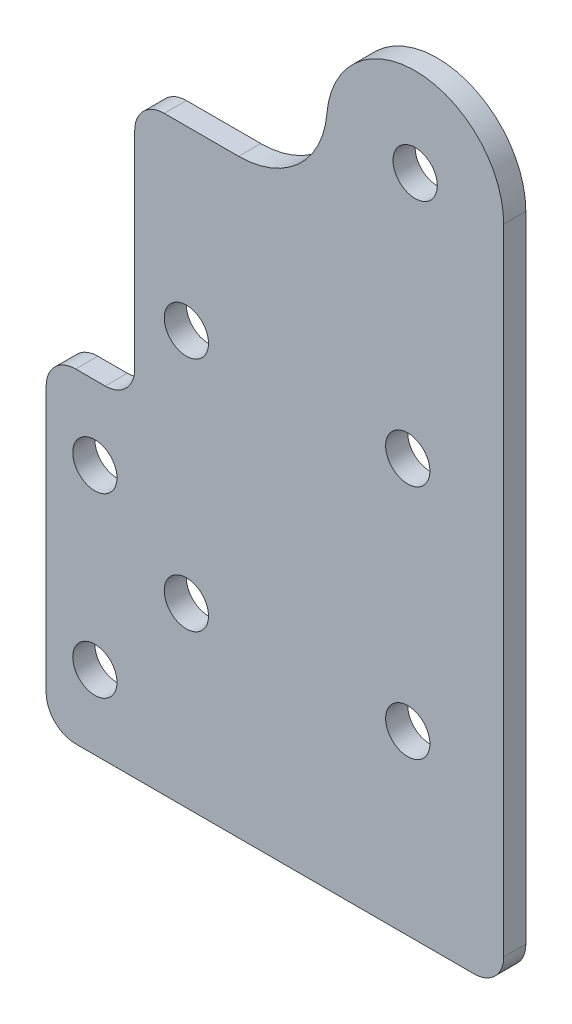
ISO-10303-21;
HEADER;
FILE_DESCRIPTION(('STEP AP214'),'2;1');
FILE_NAME('part.step','',(''),(''),'','','');
FILE_SCHEMA(('AUTOMOTIVE_DESIGN { 1 0 10303 214 1 1 1 1 }'));
ENDSEC;
DATA;
#1=APPLICATION_CONTEXT('core data for automotive mechanical design processes');
#2=APPLICATION_PROTOCOL_DEFINITION('international standard','automotive_design',2000,#1);
#3=PRODUCT_CONTEXT('',#1,'mechanical');
#4=PRODUCT('Part','Part','',(#3));
#5=PRODUCT_RELATED_PRODUCT_CATEGORY('part','',(#4));
#6=PRODUCT_DEFINITION_FORMATION('','',#4);
#7=PRODUCT_DEFINITION_CONTEXT('part definition',#1,'design');
#8=PRODUCT_DEFINITION('design','',#6,#7);
#9=PRODUCT_DEFINITION_SHAPE('','',#8);
#10=(LENGTH_UNIT() NAMED_UNIT(*) SI_UNIT(.MILLI.,.METRE.));
#11=(NAMED_UNIT(*) PLANE_ANGLE_UNIT() SI_UNIT($,.RADIAN.));
#12=(NAMED_UNIT(*) SI_UNIT($,.STERADIAN.) SOLID_ANGLE_UNIT());
#13=UNCERTAINTY_MEASURE_WITH_UNIT(LENGTH_MEASURE(1.E-05),#10,'distance_accuracy_value','');
#14=(GEOMETRIC_REPRESENTATION_CONTEXT(3) GLOBAL_UNCERTAINTY_ASSIGNED_CONTEXT((#13)) GLOBAL_UNIT_ASSIGNED_CONTEXT((#10,
#11,#12)) REPRESENTATION_CONTEXT('',''));
#15=CARTESIAN_POINT('',(0.,0.,0.));
#16=DIRECTION('',(0.,0.,1.));
#17=DIRECTION('',(1.,0.,0.));
#18=AXIS2_PLACEMENT_3D('',#15,#16,#17);
#19=CARTESIAN_POINT('',(0.,0.,1.5));
#20=DIRECTION('',(0.,0.,-1.));
#21=DIRECTION('',(-1.,0.,0.));
#22=AXIS2_PLACEMENT_3D('',#19,#20,#21);
#23=PLANE('',#22);
#24=CARTESIAN_POINT('',(-13.7,-15.,1.5));
#25=DIRECTION('',(0.,0.,1.));
#26=DIRECTION('',(-1.,0.,0.));
#27=AXIS2_PLACEMENT_3D('',#24,#25,#26);
#28=CIRCLE('',#27,1.5);
#29=CARTESIAN_POINT('',(-15.2,-15.,1.5));
#30=VERTEX_POINT('',#29);
#31=EDGE_CURVE('E266',#30,#30,#28,.T.);
#32=ORIENTED_EDGE('',*,*,#31,.F.);
#33=EDGE_LOOP('',(#32));
#34=FACE_BOUND('',#33,.T.);
#35=CARTESIAN_POINT('',(-13.7,-3.,1.5));
#36=DIRECTION('',(0.,0.,1.));
#37=DIRECTION('',(1.,0.,0.));
#38=AXIS2_PLACEMENT_3D('',#35,#36,#37);
#39=CIRCLE('',#38,1.5);
#40=CARTESIAN_POINT('',(-12.2,-3.,1.5));
#41=VERTEX_POINT('',#40);
#42=EDGE_CURVE('E276',#41,#41,#39,.T.);
#43=ORIENTED_EDGE('',*,*,#42,.F.);
#44=EDGE_LOOP('',(#43));
#45=FACE_BOUND('',#44,.T.);
#46=DIRECTION('',(-1.,0.,0.));
#47=VECTOR('',#46,1.);
#48=CARTESIAN_POINT('',(-14.,20.,1.5));
#49=LINE('',#48,#47);
#50=CARTESIAN_POINT('',(-3.9582607431014,20.,1.5));
#51=VERTEX_POINT('',#50);
#52=CARTESIAN_POINT('',(-9.,20.,1.5));
#53=VERTEX_POINT('',#52);
#54=EDGE_CURVE('E189',#51,#53,#49,.T.);
#55=ORIENTED_EDGE('',*,*,#54,.T.);
#56=CARTESIAN_POINT('',(-9.,18.,1.5));
#57=DIRECTION('',(0.,0.,-1.));
#58=DIRECTION('',(-1.,0.,0.));
#59=AXIS2_PLACEMENT_3D('',#56,#57,#58);
#60=CIRCLE('',#59,2.);
#61=CARTESIAN_POINT('',(-11.,18.,1.5));
#62=VERTEX_POINT('',#61);
#63=EDGE_CURVE('E216',#53,#62,#60,.F.);
#64=ORIENTED_EDGE('',*,*,#63,.T.);
#65=DIRECTION('',(0.,1.,0.));
#66=VECTOR('',#65,1.);
#67=CARTESIAN_POINT('',(-11.,2.,1.5));
#68=LINE('',#67,#66);
#69=CARTESIAN_POINT('',(-11.,4.00000000000001,1.5));
#70=VERTEX_POINT('',#69);
#71=EDGE_CURVE('E249',#70,#62,#68,.T.);
#72=ORIENTED_EDGE('',*,*,#71,.F.);
#73=CARTESIAN_POINT('',(-13.,4.00000000000001,1.5));
#74=DIRECTION('',(0.,0.,-1.));
#75=DIRECTION('',(-1.,0.,0.));
#76=AXIS2_PLACEMENT_3D('',#73,#74,#75);
#77=CIRCLE('',#76,2.);
#78=CARTESIAN_POINT('',(-13.,2.00000000000001,1.5));
#79=VERTEX_POINT('',#78);
#80=EDGE_CURVE('E40',#70,#79,#77,.T.);
#81=ORIENTED_EDGE('',*,*,#80,.T.);
#82=DIRECTION('',(-1.,0.,0.));
#83=VECTOR('',#82,1.);
#84=CARTESIAN_POINT('',(-14.,2.00000000000001,1.5));
#85=LINE('',#84,#83);
#86=CARTESIAN_POINT('',(-15.,2.,1.5));
#87=VERTEX_POINT('',#86);
#88=EDGE_CURVE('E247',#79,#87,#85,.T.);
#89=ORIENTED_EDGE('',*,*,#88,.T.);
#90=CARTESIAN_POINT('',(-15.,0.,1.5));
#91=DIRECTION('',(0.,0.,-1.));
#92=DIRECTION('',(-1.,0.,0.));
#93=AXIS2_PLACEMENT_3D('',#90,#91,#92);
#94=CIRCLE('',#93,2.);
#95=CARTESIAN_POINT('',(-17.,0.,1.5));
#96=VERTEX_POINT('',#95);
#97=EDGE_CURVE('E210',#87,#96,#94,.F.);
#98=ORIENTED_EDGE('',*,*,#97,.T.);
#99=DIRECTION('',(0.,-1.,0.));
#100=VECTOR('',#99,1.);
#101=CARTESIAN_POINT('',(-17.,2.,1.5));
#102=LINE('',#101,#100);
#103=CARTESIAN_POINT('',(-17.,-18.,1.5));
#104=VERTEX_POINT('',#103);
#105=EDGE_CURVE('E254',#96,#104,#102,.T.);
#106=ORIENTED_EDGE('',*,*,#105,.T.);
#107=CARTESIAN_POINT('',(-15.,-18.,1.5));
#108=DIRECTION('',(0.,0.,-1.));
#109=DIRECTION('',(-1.,0.,0.));
#110=AXIS2_PLACEMENT_3D('',#107,#108,#109);
#111=CIRCLE('',#110,2.);
#112=CARTESIAN_POINT('',(-15.,-20.,1.5));
#113=VERTEX_POINT('',#112);
#114=EDGE_CURVE('E214',#104,#113,#111,.F.);
#115=ORIENTED_EDGE('',*,*,#114,.T.);
#116=DIRECTION('',(1.,0.,0.));
#117=VECTOR('',#116,1.);
#118=CARTESIAN_POINT('',(-14.,-20.,1.5));
#119=LINE('',#118,#117);
#120=CARTESIAN_POINT('',(12.,-20.,1.5));
#121=VERTEX_POINT('',#120);
#122=EDGE_CURVE('E193',#113,#121,#119,.T.);
#123=ORIENTED_EDGE('',*,*,#122,.T.);
#124=CARTESIAN_POINT('',(12.,-18.,1.5));
#125=DIRECTION('',(0.,0.,-1.));
#126=DIRECTION('',(-1.,0.,0.));
#127=AXIS2_PLACEMENT_3D('',#124,#125,#126);
#128=CIRCLE('',#127,2.);
#129=CARTESIAN_POINT('',(14.,-18.,1.5));
#130=VERTEX_POINT('',#129);
#131=EDGE_CURVE('E212',#121,#130,#128,.F.);
#132=ORIENTED_EDGE('',*,*,#131,.T.);
#133=DIRECTION('',(0.,1.,0.));
#134=VECTOR('',#133,1.);
#135=CARTESIAN_POINT('',(14.,-20.,1.5));
#136=LINE('',#135,#134);
#137=CARTESIAN_POINT('',(14.,25.,1.5));
#138=VERTEX_POINT('',#137);
#139=EDGE_CURVE('E187',#130,#138,#136,.T.);
#140=ORIENTED_EDGE('',*,*,#139,.T.);
#141=CARTESIAN_POINT('',(8.,25.,1.5));
#142=DIRECTION('',(0.,0.,1.));
#143=DIRECTION('',(1.,0.,0.));
#144=AXIS2_PLACEMENT_3D('',#141,#142,#143);
#145=CIRCLE('',#144,6.);
#146=CARTESIAN_POINT('',(2.0208696284493,25.5,1.5));
#147=VERTEX_POINT('',#146);
#148=EDGE_CURVE('E156',#138,#147,#145,.T.);
#149=ORIENTED_EDGE('',*,*,#148,.T.);
#150=CARTESIAN_POINT('',(-3.9582607431014,26.,1.5));
#151=DIRECTION('',(0.,0.,-1.));
#152=DIRECTION('',(-1.,0.,0.));
#153=AXIS2_PLACEMENT_3D('',#150,#151,#152);
#154=CIRCLE('',#153,6.);
#155=EDGE_CURVE('E204',#147,#51,#154,.T.);
#156=ORIENTED_EDGE('',*,*,#155,.T.);
#157=EDGE_LOOP('',(#55,#64,#72,#81,#89,#98,#106,#115,#123,#132,#140,#149,#156));
#158=FACE_BOUND('',#157,.T.);
#159=CARTESIAN_POINT('',(-7.5,8.,1.5));
#160=DIRECTION('',(0.,0.,1.));
#161=DIRECTION('',(1.,0.,0.));
#162=AXIS2_PLACEMENT_3D('',#159,#160,#161);
#163=CIRCLE('',#162,1.5);
#164=CARTESIAN_POINT('',(-6.,8.,1.5));
#165=VERTEX_POINT('',#164);
#166=EDGE_CURVE('E139',#165,#165,#163,.T.);
#167=ORIENTED_EDGE('',*,*,#166,.F.);
#168=EDGE_LOOP('',(#167));
#169=FACE_BOUND('',#168,.T.);
#170=CARTESIAN_POINT('',(7.5,8.,1.5));
#171=DIRECTION('',(0.,0.,1.));
#172=DIRECTION('',(-1.,0.,0.));
#173=AXIS2_PLACEMENT_3D('',#170,#171,#172);
#174=CIRCLE('',#173,1.5);
#175=CARTESIAN_POINT('',(6.,8.,1.5));
#176=VERTEX_POINT('',#175);
#177=EDGE_CURVE('E177',#176,#176,#174,.T.);
#178=ORIENTED_EDGE('',*,*,#177,.F.);
#179=EDGE_LOOP('',(#178));
#180=FACE_BOUND('',#179,.T.);
#181=CARTESIAN_POINT('',(7.5,-8.,1.5));
#182=DIRECTION('',(0.,0.,1.));
#183=DIRECTION('',(1.,0.,0.));
#184=AXIS2_PLACEMENT_3D('',#181,#182,#183);
#185=CIRCLE('',#184,1.5);
#186=CARTESIAN_POINT('',(9.00000000000001,-8.,1.5));
#187=VERTEX_POINT('',#186);
#188=EDGE_CURVE('E171',#187,#187,#185,.T.);
#189=ORIENTED_EDGE('',*,*,#188,.F.);
#190=EDGE_LOOP('',(#189));
#191=FACE_BOUND('',#190,.T.);
#192=CARTESIAN_POINT('',(-7.5,-8.,1.5));
#193=DIRECTION('',(0.,0.,1.));
#194=DIRECTION('',(-1.,0.,0.));
#195=AXIS2_PLACEMENT_3D('',#192,#193,#194);
#196=CIRCLE('',#195,1.5);
#197=CARTESIAN_POINT('',(-9.,-8.,1.5));
#198=VERTEX_POINT('',#197);
#199=EDGE_CURVE('E163',#198,#198,#196,.T.);
#200=ORIENTED_EDGE('',*,*,#199,.F.);
#201=EDGE_LOOP('',(#200));
#202=FACE_BOUND('',#201,.T.);
#203=CARTESIAN_POINT('',(8.,25.,1.5));
#204=DIRECTION('',(0.,0.,1.));
#205=DIRECTION('',(1.,0.,0.));
#206=AXIS2_PLACEMENT_3D('',#203,#204,#205);
#207=CIRCLE('',#206,1.5);
#208=CARTESIAN_POINT('',(9.5,25.,1.5));
#209=VERTEX_POINT('',#208);
#210=EDGE_CURVE('E157',#209,#209,#207,.T.);
#211=ORIENTED_EDGE('',*,*,#210,.F.);
#212=EDGE_LOOP('',(#211));
#213=FACE_BOUND('',#212,.T.);
#214=ADVANCED_FACE('F32',(#34,#45,#158,#169,#180,#191,#202,#213),#23,.F.);
#215=CARTESIAN_POINT('',(0.,0.,0.));
#216=DIRECTION('',(0.,0.,-1.));
#217=DIRECTION('',(-1.,0.,0.));
#218=AXIS2_PLACEMENT_3D('',#215,#216,#217);
#219=PLANE('',#218);
#220=DIRECTION('',(0.,1.,0.));
#221=VECTOR('',#220,1.);
#222=CARTESIAN_POINT('',(-11.,2.,0.));
#223=LINE('',#222,#221);
#224=CARTESIAN_POINT('',(-11.,4.00000000000001,0.));
#225=VERTEX_POINT('',#224);
#226=CARTESIAN_POINT('',(-11.,18.,0.));
#227=VERTEX_POINT('',#226);
#228=EDGE_CURVE('E260',#225,#227,#223,.T.);
#229=ORIENTED_EDGE('',*,*,#228,.T.);
#230=CARTESIAN_POINT('',(-9.,18.,0.));
#231=DIRECTION('',(0.,0.,-1.));
#232=DIRECTION('',(-1.,0.,0.));
#233=AXIS2_PLACEMENT_3D('',#230,#231,#232);
#234=CIRCLE('',#233,2.);
#235=CARTESIAN_POINT('',(-9.,20.,0.));
#236=VERTEX_POINT('',#235);
#237=EDGE_CURVE('E228',#227,#236,#234,.T.);
#238=ORIENTED_EDGE('',*,*,#237,.T.);
#239=DIRECTION('',(-1.,0.,0.));
#240=VECTOR('',#239,1.);
#241=CARTESIAN_POINT('',(-14.,20.,0.));
#242=LINE('',#241,#240);
#243=CARTESIAN_POINT('',(-3.9582607431014,20.,0.));
#244=VERTEX_POINT('',#243);
#245=EDGE_CURVE('E138',#244,#236,#242,.T.);
#246=ORIENTED_EDGE('',*,*,#245,.F.);
#247=CARTESIAN_POINT('',(-3.9582607431014,26.,0.));
#248=DIRECTION('',(0.,0.,-1.));
#249=DIRECTION('',(-1.,0.,0.));
#250=AXIS2_PLACEMENT_3D('',#247,#248,#249);
#251=CIRCLE('',#250,6.);
#252=CARTESIAN_POINT('',(2.0208696284493,25.5,0.));
#253=VERTEX_POINT('',#252);
#254=EDGE_CURVE('E148',#244,#253,#251,.F.);
#255=ORIENTED_EDGE('',*,*,#254,.T.);
#256=CARTESIAN_POINT('',(8.,25.,0.));
#257=DIRECTION('',(0.,0.,-1.));
#258=DIRECTION('',(-1.,0.,0.));
#259=AXIS2_PLACEMENT_3D('',#256,#257,#258);
#260=CIRCLE('',#259,6.);
#261=CARTESIAN_POINT('',(14.,25.,0.));
#262=VERTEX_POINT('',#261);
#263=EDGE_CURVE('E142',#262,#253,#260,.F.);
#264=ORIENTED_EDGE('',*,*,#263,.F.);
#265=DIRECTION('',(0.,1.,0.));
#266=VECTOR('',#265,1.);
#267=CARTESIAN_POINT('',(14.,-20.,0.));
#268=LINE('',#267,#266);
#269=CARTESIAN_POINT('',(14.,-18.,0.));
#270=VERTEX_POINT('',#269);
#271=EDGE_CURVE('E129',#270,#262,#268,.T.);
#272=ORIENTED_EDGE('',*,*,#271,.F.);
#273=CARTESIAN_POINT('',(12.,-18.,0.));
#274=DIRECTION('',(0.,0.,-1.));
#275=DIRECTION('',(-1.,0.,0.));
#276=AXIS2_PLACEMENT_3D('',#273,#274,#275);
#277=CIRCLE('',#276,2.);
#278=CARTESIAN_POINT('',(12.,-20.,0.));
#279=VERTEX_POINT('',#278);
#280=EDGE_CURVE('E224',#270,#279,#277,.T.);
#281=ORIENTED_EDGE('',*,*,#280,.T.);
#282=DIRECTION('',(1.,0.,0.));
#283=VECTOR('',#282,1.);
#284=CARTESIAN_POINT('',(-14.,-20.,0.));
#285=LINE('',#284,#283);
#286=CARTESIAN_POINT('',(-15.,-20.,0.));
#287=VERTEX_POINT('',#286);
#288=EDGE_CURVE('E190',#287,#279,#285,.T.);
#289=ORIENTED_EDGE('',*,*,#288,.F.);
#290=CARTESIAN_POINT('',(-15.,-18.,0.));
#291=DIRECTION('',(0.,0.,-1.));
#292=DIRECTION('',(-1.,0.,0.));
#293=AXIS2_PLACEMENT_3D('',#290,#291,#292);
#294=CIRCLE('',#293,2.);
#295=CARTESIAN_POINT('',(-17.,-18.,0.));
#296=VERTEX_POINT('',#295);
#297=EDGE_CURVE('E226',#287,#296,#294,.T.);
#298=ORIENTED_EDGE('',*,*,#297,.T.);
#299=DIRECTION('',(0.,-1.,0.));
#300=VECTOR('',#299,1.);
#301=CARTESIAN_POINT('',(-17.,2.,0.));
#302=LINE('',#301,#300);
#303=CARTESIAN_POINT('',(-17.,0.,0.));
#304=VERTEX_POINT('',#303);
#305=EDGE_CURVE('E152',#304,#296,#302,.T.);
#306=ORIENTED_EDGE('',*,*,#305,.F.);
#307=CARTESIAN_POINT('',(-15.,0.,0.));
#308=DIRECTION('',(0.,0.,-1.));
#309=DIRECTION('',(-1.,0.,0.));
#310=AXIS2_PLACEMENT_3D('',#307,#308,#309);
#311=CIRCLE('',#310,2.);
#312=CARTESIAN_POINT('',(-15.,2.,0.));
#313=VERTEX_POINT('',#312);
#314=EDGE_CURVE('E47',#304,#313,#311,.T.);
#315=ORIENTED_EDGE('',*,*,#314,.T.);
#316=DIRECTION('',(-1.,0.,0.));
#317=VECTOR('',#316,1.);
#318=CARTESIAN_POINT('',(-14.,2.00000000000001,0.));
#319=LINE('',#318,#317);
#320=CARTESIAN_POINT('',(-13.,2.00000000000001,0.));
#321=VERTEX_POINT('',#320);
#322=EDGE_CURVE('E262',#321,#313,#319,.T.);
#323=ORIENTED_EDGE('',*,*,#322,.F.);
#324=CARTESIAN_POINT('',(-13.,4.00000000000001,0.));
#325=DIRECTION('',(0.,0.,-1.));
#326=DIRECTION('',(-1.,0.,0.));
#327=AXIS2_PLACEMENT_3D('',#324,#325,#326);
#328=CIRCLE('',#327,2.);
#329=EDGE_CURVE('E11',#321,#225,#328,.F.);
#330=ORIENTED_EDGE('',*,*,#329,.T.);
#331=EDGE_LOOP('',(#229,#238,#246,#255,#264,#272,#281,#289,#298,#306,#315,#323,#330));
#332=FACE_BOUND('',#331,.T.);
#333=CARTESIAN_POINT('',(-13.7,-15.,0.));
#334=DIRECTION('',(0.,0.,1.));
#335=DIRECTION('',(-1.,0.,0.));
#336=AXIS2_PLACEMENT_3D('',#333,#334,#335);
#337=CIRCLE('',#336,1.5);
#338=CARTESIAN_POINT('',(-15.2,-15.,0.));
#339=VERTEX_POINT('',#338);
#340=EDGE_CURVE('E269',#339,#339,#337,.T.);
#341=ORIENTED_EDGE('',*,*,#340,.T.);
#342=EDGE_LOOP('',(#341));
#343=FACE_BOUND('',#342,.T.);
#344=CARTESIAN_POINT('',(-13.7,-3.,0.));
#345=DIRECTION('',(0.,0.,1.));
#346=DIRECTION('',(1.,0.,0.));
#347=AXIS2_PLACEMENT_3D('',#344,#345,#346);
#348=CIRCLE('',#347,1.5);
#349=CARTESIAN_POINT('',(-12.2,-3.,0.));
#350=VERTEX_POINT('',#349);
#351=EDGE_CURVE('E255',#350,#350,#348,.T.);
#352=ORIENTED_EDGE('',*,*,#351,.T.);
#353=EDGE_LOOP('',(#352));
#354=FACE_BOUND('',#353,.T.);
#355=CARTESIAN_POINT('',(7.5,-8.,0.));
#356=DIRECTION('',(0.,0.,1.));
#357=DIRECTION('',(1.,0.,0.));
#358=AXIS2_PLACEMENT_3D('',#355,#356,#357);
#359=CIRCLE('',#358,1.5);
#360=CARTESIAN_POINT('',(9.00000000000001,-8.,0.));
#361=VERTEX_POINT('',#360);
#362=EDGE_CURVE('E166',#361,#361,#359,.T.);
#363=ORIENTED_EDGE('',*,*,#362,.T.);
#364=EDGE_LOOP('',(#363));
#365=FACE_BOUND('',#364,.T.);
#366=CARTESIAN_POINT('',(-7.5,8.,0.));
#367=DIRECTION('',(0.,0.,1.));
#368=DIRECTION('',(1.,0.,0.));
#369=AXIS2_PLACEMENT_3D('',#366,#367,#368);
#370=CIRCLE('',#369,1.5);
#371=CARTESIAN_POINT('',(-6.,8.,0.));
#372=VERTEX_POINT('',#371);
#373=EDGE_CURVE('E180',#372,#372,#370,.T.);
#374=ORIENTED_EDGE('',*,*,#373,.T.);
#375=EDGE_LOOP('',(#374));
#376=FACE_BOUND('',#375,.T.);
#377=CARTESIAN_POINT('',(7.5,8.,0.));
#378=DIRECTION('',(0.,0.,1.));
#379=DIRECTION('',(-1.,0.,0.));
#380=AXIS2_PLACEMENT_3D('',#377,#378,#379);
#381=CIRCLE('',#380,1.5);
#382=CARTESIAN_POINT('',(6.,8.,0.));
#383=VERTEX_POINT('',#382);
#384=EDGE_CURVE('E174',#383,#383,#381,.T.);
#385=ORIENTED_EDGE('',*,*,#384,.T.);
#386=EDGE_LOOP('',(#385));
#387=FACE_BOUND('',#386,.T.);
#388=CARTESIAN_POINT('',(-7.5,-8.,0.));
#389=DIRECTION('',(0.,0.,1.));
#390=DIRECTION('',(-1.,0.,0.));
#391=AXIS2_PLACEMENT_3D('',#388,#389,#390);
#392=CIRCLE('',#391,1.5);
#393=CARTESIAN_POINT('',(-9.,-8.,0.));
#394=VERTEX_POINT('',#393);
#395=EDGE_CURVE('E167',#394,#394,#392,.T.);
#396=ORIENTED_EDGE('',*,*,#395,.T.);
#397=EDGE_LOOP('',(#396));
#398=FACE_BOUND('',#397,.T.);
#399=CARTESIAN_POINT('',(8.,25.,0.));
#400=DIRECTION('',(0.,0.,-1.));
#401=DIRECTION('',(-1.,0.,0.));
#402=AXIS2_PLACEMENT_3D('',#399,#400,#401);
#403=CIRCLE('',#402,1.5);
#404=CARTESIAN_POINT('',(6.5,25.,0.));
#405=VERTEX_POINT('',#404);
#406=EDGE_CURVE('E170',#405,#405,#403,.F.);
#407=ORIENTED_EDGE('',*,*,#406,.T.);
#408=EDGE_LOOP('',(#407));
#409=FACE_BOUND('',#408,.T.);
#410=ADVANCED_FACE('F144',(#332,#343,#354,#365,#376,#387,#398,#409),#219,.T.);
#411=CARTESIAN_POINT('',(14.,-20.,1.5));
#412=DIRECTION('',(-1.,0.,0.));
#413=DIRECTION('',(0.,0.,1.));
#414=AXIS2_PLACEMENT_3D('',#411,#412,#413);
#415=PLANE('',#414);
#416=ORIENTED_EDGE('',*,*,#139,.F.);
#417=DIRECTION('',(0.,0.,-1.));
#418=VECTOR('',#417,1.);
#419=CARTESIAN_POINT('',(14.,-18.,1.5));
#420=LINE('',#419,#418);
#421=EDGE_CURVE('E137',#130,#270,#420,.T.);
#422=ORIENTED_EDGE('',*,*,#421,.T.);
#423=ORIENTED_EDGE('',*,*,#271,.T.);
#424=DIRECTION('',(0.,0.,1.));
#425=VECTOR('',#424,1.);
#426=CARTESIAN_POINT('',(14.,25.,-22.2036033111745));
#427=LINE('',#426,#425);
#428=EDGE_CURVE('E134',#262,#138,#427,.T.);
#429=ORIENTED_EDGE('',*,*,#428,.T.);
#430=EDGE_LOOP('',(#416,#422,#423,#429));
#431=FACE_BOUND('',#430,.T.);
#432=ADVANCED_FACE('F132',(#431),#415,.F.);
#433=CARTESIAN_POINT('',(-14.,20.,1.5));
#434=DIRECTION('',(0.,-1.,0.));
#435=DIRECTION('',(0.,0.,-1.));
#436=AXIS2_PLACEMENT_3D('',#433,#434,#435);
#437=PLANE('',#436);
#438=ORIENTED_EDGE('',*,*,#245,.T.);
#439=DIRECTION('',(0.,0.,1.));
#440=VECTOR('',#439,1.);
#441=CARTESIAN_POINT('',(-9.,20.,1.5));
#442=LINE('',#441,#440);
#443=EDGE_CURVE('E207',#236,#53,#442,.T.);
#444=ORIENTED_EDGE('',*,*,#443,.T.);
#445=ORIENTED_EDGE('',*,*,#54,.F.);
#446=DIRECTION('',(0.,0.,1.));
#447=VECTOR('',#446,1.);
#448=CARTESIAN_POINT('',(-3.9582607431014,20.,1.5));
#449=LINE('',#448,#447);
#450=EDGE_CURVE('E202',#51,#244,#449,.F.);
#451=ORIENTED_EDGE('',*,*,#450,.T.);
#452=EDGE_LOOP('',(#438,#444,#445,#451));
#453=FACE_BOUND('',#452,.T.);
#454=ADVANCED_FACE('F317',(#453),#437,.F.);
#455=CARTESIAN_POINT('',(-14.,-20.,1.5));
#456=DIRECTION('',(0.,1.,0.));
#457=DIRECTION('',(0.,0.,1.));
#458=AXIS2_PLACEMENT_3D('',#455,#456,#457);
#459=PLANE('',#458);
#460=ORIENTED_EDGE('',*,*,#122,.F.);
#461=DIRECTION('',(0.,0.,1.));
#462=VECTOR('',#461,1.);
#463=CARTESIAN_POINT('',(-15.,-20.,0.));
#464=LINE('',#463,#462);
#465=EDGE_CURVE('E241',#113,#287,#464,.F.);
#466=ORIENTED_EDGE('',*,*,#465,.T.);
#467=ORIENTED_EDGE('',*,*,#288,.T.);
#468=DIRECTION('',(0.,0.,-1.));
#469=VECTOR('',#468,1.);
#470=CARTESIAN_POINT('',(12.,-20.,1.5));
#471=LINE('',#470,#469);
#472=EDGE_CURVE('E239',#279,#121,#471,.F.);
#473=ORIENTED_EDGE('',*,*,#472,.T.);
#474=EDGE_LOOP('',(#460,#466,#467,#473));
#475=FACE_BOUND('',#474,.T.);
#476=ADVANCED_FACE('F314',(#475),#459,.F.);
#477=CARTESIAN_POINT('',(-7.5,8.,1.5));
#478=DIRECTION('',(0.,0.,-1.));
#479=DIRECTION('',(-1.,0.,0.));
#480=AXIS2_PLACEMENT_3D('',#477,#478,#479);
#481=CYLINDRICAL_SURFACE('',#480,1.5);
#482=ORIENTED_EDGE('',*,*,#166,.T.);
#483=EDGE_LOOP('',(#482));
#484=FACE_BOUND('',#483,.T.);
#485=ORIENTED_EDGE('',*,*,#373,.F.);
#486=EDGE_LOOP('',(#485));
#487=FACE_BOUND('',#486,.T.);
#488=ADVANCED_FACE('F311',(#484,#487),#481,.F.);
#489=CARTESIAN_POINT('',(7.5,8.,1.5));
#490=DIRECTION('',(0.,0.,-1.));
#491=DIRECTION('',(-1.,0.,0.));
#492=AXIS2_PLACEMENT_3D('',#489,#490,#491);
#493=CYLINDRICAL_SURFACE('',#492,1.5);
#494=ORIENTED_EDGE('',*,*,#177,.T.);
#495=EDGE_LOOP('',(#494));
#496=FACE_BOUND('',#495,.T.);
#497=ORIENTED_EDGE('',*,*,#384,.F.);
#498=EDGE_LOOP('',(#497));
#499=FACE_BOUND('',#498,.T.);
#500=ADVANCED_FACE('F390',(#496,#499),#493,.F.);
#501=CARTESIAN_POINT('',(7.5,-8.,1.5));
#502=DIRECTION('',(0.,0.,-1.));
#503=DIRECTION('',(-1.,0.,0.));
#504=AXIS2_PLACEMENT_3D('',#501,#502,#503);
#505=CYLINDRICAL_SURFACE('',#504,1.5);
#506=ORIENTED_EDGE('',*,*,#188,.T.);
#507=EDGE_LOOP('',(#506));
#508=FACE_BOUND('',#507,.T.);
#509=ORIENTED_EDGE('',*,*,#362,.F.);
#510=EDGE_LOOP('',(#509));
#511=FACE_BOUND('',#510,.T.);
#512=ADVANCED_FACE('F385',(#508,#511),#505,.F.);
#513=CARTESIAN_POINT('',(-7.5,-8.,1.5));
#514=DIRECTION('',(0.,0.,-1.));
#515=DIRECTION('',(-1.,0.,0.));
#516=AXIS2_PLACEMENT_3D('',#513,#514,#515);
#517=CYLINDRICAL_SURFACE('',#516,1.5);
#518=ORIENTED_EDGE('',*,*,#199,.T.);
#519=EDGE_LOOP('',(#518));
#520=FACE_BOUND('',#519,.T.);
#521=ORIENTED_EDGE('',*,*,#395,.F.);
#522=EDGE_LOOP('',(#521));
#523=FACE_BOUND('',#522,.T.);
#524=ADVANCED_FACE('F298',(#520,#523),#517,.F.);
#525=CARTESIAN_POINT('',(8.,25.,-22.2036033111745));
#526=DIRECTION('',(0.,0.,1.));
#527=DIRECTION('',(1.,0.,0.));
#528=AXIS2_PLACEMENT_3D('',#525,#526,#527);
#529=CYLINDRICAL_SURFACE('',#528,6.);
#530=ORIENTED_EDGE('',*,*,#263,.T.);
#531=DIRECTION('',(0.,0.,1.));
#532=VECTOR('',#531,1.);
#533=CARTESIAN_POINT('',(2.0208696284493,25.5,-22.2036033111745));
#534=LINE('',#533,#532);
#535=EDGE_CURVE('E195',#253,#147,#534,.T.);
#536=ORIENTED_EDGE('',*,*,#535,.T.);
#537=ORIENTED_EDGE('',*,*,#148,.F.);
#538=ORIENTED_EDGE('',*,*,#428,.F.);
#539=EDGE_LOOP('',(#530,#536,#537,#538));
#540=FACE_BOUND('',#539,.T.);
#541=ADVANCED_FACE('F154',(#540),#529,.T.);
#542=CARTESIAN_POINT('',(8.,25.,-22.2036033111745));
#543=DIRECTION('',(0.,0.,1.));
#544=DIRECTION('',(1.,0.,0.));
#545=AXIS2_PLACEMENT_3D('',#542,#543,#544);
#546=CYLINDRICAL_SURFACE('',#545,1.5);
#547=ORIENTED_EDGE('',*,*,#210,.T.);
#548=EDGE_LOOP('',(#547));
#549=FACE_BOUND('',#548,.T.);
#550=ORIENTED_EDGE('',*,*,#406,.F.);
#551=EDGE_LOOP('',(#550));
#552=FACE_BOUND('',#551,.T.);
#553=ADVANCED_FACE('F288',(#549,#552),#546,.F.);
#554=CARTESIAN_POINT('',(-14.,2.00000000000001,-22.2036033111745));
#555=DIRECTION('',(0.,1.,0.));
#556=DIRECTION('',(-1.,0.,0.));
#557=AXIS2_PLACEMENT_3D('',#554,#555,#556);
#558=PLANE('',#557);
#559=ORIENTED_EDGE('',*,*,#88,.F.);
#560=DIRECTION('',(0.,0.,1.));
#561=VECTOR('',#560,1.);
#562=CARTESIAN_POINT('',(-13.,2.00000000000001,-22.2036033111745));
#563=LINE('',#562,#561);
#564=EDGE_CURVE('E54',#79,#321,#563,.F.);
#565=ORIENTED_EDGE('',*,*,#564,.T.);
#566=ORIENTED_EDGE('',*,*,#322,.T.);
#567=DIRECTION('',(0.,0.,1.));
#568=VECTOR('',#567,1.);
#569=CARTESIAN_POINT('',(-15.,2.,-22.2036033111745));
#570=LINE('',#569,#568);
#571=EDGE_CURVE('E230',#313,#87,#570,.T.);
#572=ORIENTED_EDGE('',*,*,#571,.T.);
#573=EDGE_LOOP('',(#559,#565,#566,#572));
#574=FACE_BOUND('',#573,.T.);
#575=ADVANCED_FACE('F252',(#574),#558,.T.);
#576=CARTESIAN_POINT('',(-17.,2.,-22.2036033111745));
#577=DIRECTION('',(-1.,0.,0.));
#578=DIRECTION('',(0.,0.,1.));
#579=AXIS2_PLACEMENT_3D('',#576,#577,#578);
#580=PLANE('',#579);
#581=ORIENTED_EDGE('',*,*,#305,.T.);
#582=DIRECTION('',(0.,0.,1.));
#583=VECTOR('',#582,1.);
#584=CARTESIAN_POINT('',(-17.,-18.,1.5));
#585=LINE('',#584,#583);
#586=EDGE_CURVE('E236',#296,#104,#585,.T.);
#587=ORIENTED_EDGE('',*,*,#586,.T.);
#588=ORIENTED_EDGE('',*,*,#105,.F.);
#589=DIRECTION('',(0.,0.,1.));
#590=VECTOR('',#589,1.);
#591=CARTESIAN_POINT('',(-17.,0.,-22.2036033111745));
#592=LINE('',#591,#590);
#593=EDGE_CURVE('E234',#96,#304,#592,.F.);
#594=ORIENTED_EDGE('',*,*,#593,.T.);
#595=EDGE_LOOP('',(#581,#587,#588,#594));
#596=FACE_BOUND('',#595,.T.);
#597=ADVANCED_FACE('F296',(#596),#580,.T.);
#598=CARTESIAN_POINT('',(-3.9582607431014,26.,-22.2036033111745));
#599=DIRECTION('',(0.,0.,1.));
#600=DIRECTION('',(1.,0.,0.));
#601=AXIS2_PLACEMENT_3D('',#598,#599,#600);
#602=CYLINDRICAL_SURFACE('',#601,6.);
#603=ORIENTED_EDGE('',*,*,#254,.F.);
#604=ORIENTED_EDGE('',*,*,#450,.F.);
#605=ORIENTED_EDGE('',*,*,#155,.F.);
#606=ORIENTED_EDGE('',*,*,#535,.F.);
#607=EDGE_LOOP('',(#603,#604,#605,#606));
#608=FACE_BOUND('',#607,.T.);
#609=ADVANCED_FACE('F324',(#608),#602,.F.);
#610=CARTESIAN_POINT('',(-11.,2.,0.));
#611=DIRECTION('',(1.,0.,0.));
#612=DIRECTION('',(0.,0.,-1.));
#613=AXIS2_PLACEMENT_3D('',#610,#611,#612);
#614=PLANE('',#613);
#615=ORIENTED_EDGE('',*,*,#71,.T.);
#616=DIRECTION('',(0.,0.,1.));
#617=VECTOR('',#616,1.);
#618=CARTESIAN_POINT('',(-11.,18.,0.));
#619=LINE('',#618,#617);
#620=EDGE_CURVE('E221',#62,#227,#619,.F.);
#621=ORIENTED_EDGE('',*,*,#620,.T.);
#622=ORIENTED_EDGE('',*,*,#228,.F.);
#623=DIRECTION('',(0.,0.,1.));
#624=VECTOR('',#623,1.);
#625=CARTESIAN_POINT('',(-11.,4.00000000000001,0.));
#626=LINE('',#625,#624);
#627=EDGE_CURVE('E218',#225,#70,#626,.T.);
#628=ORIENTED_EDGE('',*,*,#627,.T.);
#629=EDGE_LOOP('',(#615,#621,#622,#628));
#630=FACE_BOUND('',#629,.T.);
#631=ADVANCED_FACE('F264',(#630),#614,.F.);
#632=CARTESIAN_POINT('',(-13.7,-3.,0.));
#633=DIRECTION('',(0.,0.,1.));
#634=DIRECTION('',(1.,0.,0.));
#635=AXIS2_PLACEMENT_3D('',#632,#633,#634);
#636=CYLINDRICAL_SURFACE('',#635,1.5);
#637=ORIENTED_EDGE('',*,*,#351,.F.);
#638=EDGE_LOOP('',(#637));
#639=FACE_BOUND('',#638,.T.);
#640=ORIENTED_EDGE('',*,*,#42,.T.);
#641=EDGE_LOOP('',(#640));
#642=FACE_BOUND('',#641,.T.);
#643=ADVANCED_FACE('F360',(#639,#642),#636,.F.);
#644=CARTESIAN_POINT('',(-13.7,-15.,0.));
#645=DIRECTION('',(0.,0.,1.));
#646=DIRECTION('',(1.,0.,0.));
#647=AXIS2_PLACEMENT_3D('',#644,#645,#646);
#648=CYLINDRICAL_SURFACE('',#647,1.5);
#649=ORIENTED_EDGE('',*,*,#340,.F.);
#650=EDGE_LOOP('',(#649));
#651=FACE_BOUND('',#650,.T.);
#652=ORIENTED_EDGE('',*,*,#31,.T.);
#653=EDGE_LOOP('',(#652));
#654=FACE_BOUND('',#653,.T.);
#655=ADVANCED_FACE('F331',(#651,#654),#648,.F.);
#656=CARTESIAN_POINT('',(-9.,18.,1.5));
#657=DIRECTION('',(0.,0.,1.));
#658=DIRECTION('',(1.,0.,0.));
#659=AXIS2_PLACEMENT_3D('',#656,#657,#658);
#660=CYLINDRICAL_SURFACE('',#659,2.);
#661=ORIENTED_EDGE('',*,*,#237,.F.);
#662=ORIENTED_EDGE('',*,*,#620,.F.);
#663=ORIENTED_EDGE('',*,*,#63,.F.);
#664=ORIENTED_EDGE('',*,*,#443,.F.);
#665=EDGE_LOOP('',(#661,#662,#663,#664));
#666=FACE_BOUND('',#665,.T.);
#667=ADVANCED_FACE('F328',(#666),#660,.T.);
#668=CARTESIAN_POINT('',(-13.,4.00000000000001,0.));
#669=DIRECTION('',(0.,0.,1.));
#670=DIRECTION('',(1.,0.,0.));
#671=AXIS2_PLACEMENT_3D('',#668,#669,#670);
#672=CYLINDRICAL_SURFACE('',#671,2.);
#673=ORIENTED_EDGE('',*,*,#329,.F.);
#674=ORIENTED_EDGE('',*,*,#564,.F.);
#675=ORIENTED_EDGE('',*,*,#80,.F.);
#676=ORIENTED_EDGE('',*,*,#627,.F.);
#677=EDGE_LOOP('',(#673,#674,#675,#676));
#678=FACE_BOUND('',#677,.T.);
#679=ADVANCED_FACE('F258',(#678),#672,.F.);
#680=CARTESIAN_POINT('',(-15.,-18.,-22.2036033111745));
#681=DIRECTION('',(0.,0.,-1.));
#682=DIRECTION('',(-1.,0.,0.));
#683=AXIS2_PLACEMENT_3D('',#680,#681,#682);
#684=CYLINDRICAL_SURFACE('',#683,2.);
#685=ORIENTED_EDGE('',*,*,#297,.F.);
#686=ORIENTED_EDGE('',*,*,#465,.F.);
#687=ORIENTED_EDGE('',*,*,#114,.F.);
#688=ORIENTED_EDGE('',*,*,#586,.F.);
#689=EDGE_LOOP('',(#685,#686,#687,#688));
#690=FACE_BOUND('',#689,.T.);
#691=ADVANCED_FACE('F335',(#690),#684,.T.);
#692=CARTESIAN_POINT('',(12.,-18.,1.5));
#693=DIRECTION('',(0.,0.,-1.));
#694=DIRECTION('',(-1.,0.,0.));
#695=AXIS2_PLACEMENT_3D('',#692,#693,#694);
#696=CYLINDRICAL_SURFACE('',#695,2.);
#697=ORIENTED_EDGE('',*,*,#131,.F.);
#698=ORIENTED_EDGE('',*,*,#472,.F.);
#699=ORIENTED_EDGE('',*,*,#280,.F.);
#700=ORIENTED_EDGE('',*,*,#421,.F.);
#701=EDGE_LOOP('',(#697,#698,#699,#700));
#702=FACE_BOUND('',#701,.T.);
#703=ADVANCED_FACE('F337',(#702),#696,.T.);
#704=CARTESIAN_POINT('',(-15.,0.,-22.2036033111745));
#705=DIRECTION('',(0.,0.,1.));
#706=DIRECTION('',(1.,0.,0.));
#707=AXIS2_PLACEMENT_3D('',#704,#705,#706);
#708=CYLINDRICAL_SURFACE('',#707,2.);
#709=ORIENTED_EDGE('',*,*,#314,.F.);
#710=ORIENTED_EDGE('',*,*,#593,.F.);
#711=ORIENTED_EDGE('',*,*,#97,.F.);
#712=ORIENTED_EDGE('',*,*,#571,.F.);
#713=EDGE_LOOP('',(#709,#710,#711,#712));
#714=FACE_BOUND('',#713,.T.);
#715=ADVANCED_FACE('F34',(#714),#708,.T.);
#716=CLOSED_SHELL('',(#214,#410,#432,#454,#476,#488,#500,#512,#524,#541,#553,#575,#597,#609,
#631,#643,#655,#667,#679,#691,#703,#715));
#717=MANIFOLD_SOLID_BREP('B2',#716);
#718=ADVANCED_BREP_SHAPE_REPRESENTATION('',(#18,#717),#14);
#719=SHAPE_DEFINITION_REPRESENTATION(#9,#718);
ENDSEC;
END-ISO-10303-21;
